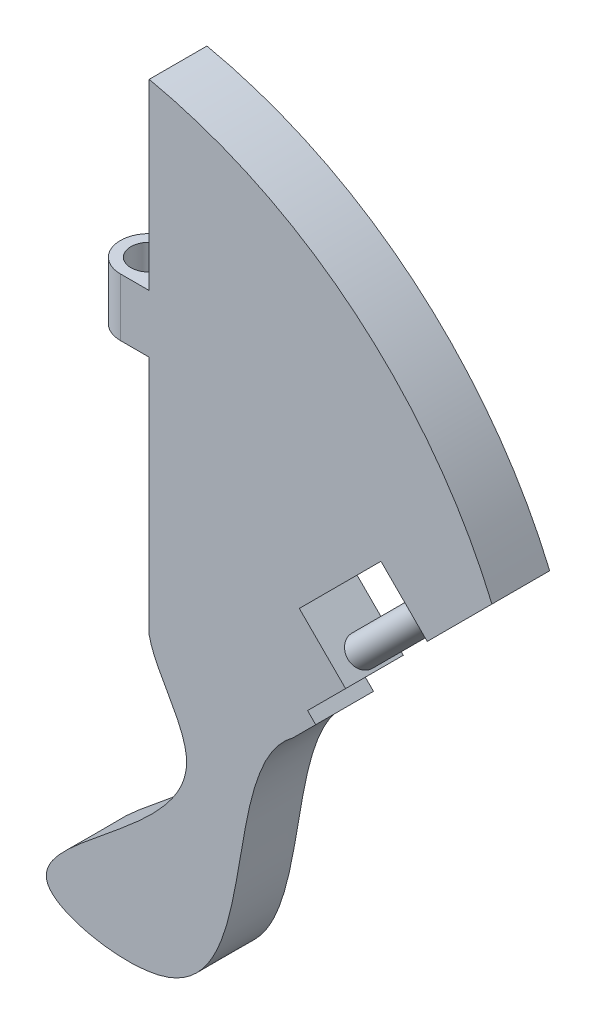
ISO-10303-21;
HEADER;
FILE_DESCRIPTION(('STEP AP214'),'2;1');
FILE_NAME('part.step','',(''),(''),'','','');
FILE_SCHEMA(('AUTOMOTIVE_DESIGN { 1 0 10303 214 1 1 1 1 }'));
ENDSEC;
DATA;
#1=APPLICATION_CONTEXT('core data for automotive mechanical design processes');
#2=APPLICATION_PROTOCOL_DEFINITION('international standard','automotive_design',2000,#1);
#3=PRODUCT_CONTEXT('',#1,'mechanical');
#4=PRODUCT('Part','Part','',(#3));
#5=PRODUCT_RELATED_PRODUCT_CATEGORY('part','',(#4));
#6=PRODUCT_DEFINITION_FORMATION('','',#4);
#7=PRODUCT_DEFINITION_CONTEXT('part definition',#1,'design');
#8=PRODUCT_DEFINITION('design','',#6,#7);
#9=PRODUCT_DEFINITION_SHAPE('','',#8);
#10=(LENGTH_UNIT() NAMED_UNIT(*) SI_UNIT(.MILLI.,.METRE.));
#11=(NAMED_UNIT(*) PLANE_ANGLE_UNIT() SI_UNIT($,.RADIAN.));
#12=(NAMED_UNIT(*) SI_UNIT($,.STERADIAN.) SOLID_ANGLE_UNIT());
#13=UNCERTAINTY_MEASURE_WITH_UNIT(LENGTH_MEASURE(1.E-05),#10,'distance_accuracy_value','');
#14=(GEOMETRIC_REPRESENTATION_CONTEXT(3) GLOBAL_UNCERTAINTY_ASSIGNED_CONTEXT((#13)) GLOBAL_UNIT_ASSIGNED_CONTEXT((#10,
#11,#12)) REPRESENTATION_CONTEXT('',''));
#15=CARTESIAN_POINT('',(0.,0.,0.));
#16=DIRECTION('',(0.,0.,1.));
#17=DIRECTION('',(1.,0.,0.));
#18=AXIS2_PLACEMENT_3D('',#15,#16,#17);
#19=CARTESIAN_POINT('',(-10.4366280712655,1.10136203837501,6.));
#20=DIRECTION('',(0.,0.,-1.));
#21=DIRECTION('',(-1.,0.,0.));
#22=AXIS2_PLACEMENT_3D('',#19,#20,#21);
#23=CYLINDRICAL_SURFACE('',#22,50.);
#24=DIRECTION('',(0.,0.,1.));
#25=VECTOR('',#24,1.);
#26=CARTESIAN_POINT('',(35.6094620937742,20.5887318073571,-4.));
#27=LINE('',#26,#25);
#28=CARTESIAN_POINT('',(35.6094620937742,20.5887318073571,0.));
#29=VERTEX_POINT('',#28);
#30=CARTESIAN_POINT('',(35.6094620937742,20.5887318073571,6.));
#31=VERTEX_POINT('',#30);
#32=EDGE_CURVE('E73',#29,#31,#27,.T.);
#33=ORIENTED_EDGE('',*,*,#32,.F.);
#34=CARTESIAN_POINT('',(-10.4366280712655,1.10136203837501,0.));
#35=DIRECTION('',(0.,0.,1.));
#36=DIRECTION('',(-1.,0.,0.));
#37=AXIS2_PLACEMENT_3D('',#34,#35,#36);
#38=CIRCLE('',#37,50.);
#39=CARTESIAN_POINT('',(0.,50.,0.));
#40=VERTEX_POINT('',#39);
#41=EDGE_CURVE('E261',#29,#40,#38,.T.);
#42=ORIENTED_EDGE('',*,*,#41,.T.);
#43=DIRECTION('',(0.,0.,-1.));
#44=VECTOR('',#43,1.);
#45=CARTESIAN_POINT('',(0.,50.,6.));
#46=LINE('',#45,#44);
#47=CARTESIAN_POINT('',(0.,50.,6.));
#48=VERTEX_POINT('',#47);
#49=EDGE_CURVE('E275',#48,#40,#46,.T.);
#50=ORIENTED_EDGE('',*,*,#49,.F.);
#51=CARTESIAN_POINT('',(-10.4366280712655,1.10136203837501,6.));
#52=DIRECTION('',(0.,0.,-1.));
#53=DIRECTION('',(-1.,0.,0.));
#54=AXIS2_PLACEMENT_3D('',#51,#52,#53);
#55=CIRCLE('',#54,50.);
#56=EDGE_CURVE('E49',#31,#48,#55,.F.);
#57=ORIENTED_EDGE('',*,*,#56,.F.);
#58=EDGE_LOOP('',(#33,#42,#50,#57));
#59=FACE_BOUND('',#58,.T.);
#60=ADVANCED_FACE('F44',(#59),#23,.T.);
#61=CARTESIAN_POINT('',(-6.85450681759513,-29.845700061581,6.));
#62=DIRECTION('',(0.,0.,-1.));
#63=DIRECTION('',(-1.,0.,0.));
#64=AXIS2_PLACEMENT_3D('',#61,#62,#63);
#65=PLANE('',#64);
#66=DIRECTION('',(-0.707106781186547,-0.707106781186548,0.));
#67=VECTOR('',#66,1.);
#68=CARTESIAN_POINT('',(16.4542124342722,1.43348214785504,6.));
#69=LINE('',#68,#67);
#70=CARTESIAN_POINT('',(28.888688886492,13.8679586000749,6.));
#71=VERTEX_POINT('',#70);
#72=EDGE_CURVE('E64',#31,#71,#69,.T.);
#73=ORIENTED_EDGE('',*,*,#72,.F.);
#74=ORIENTED_EDGE('',*,*,#56,.T.);
#75=DIRECTION('',(0.,-1.,0.));
#76=VECTOR('',#75,1.);
#77=CARTESIAN_POINT('',(0.,0.,6.));
#78=LINE('',#77,#76);
#79=CARTESIAN_POINT('',(0.,31.,6.));
#80=VERTEX_POINT('',#79);
#81=EDGE_CURVE('E246',#48,#80,#78,.T.);
#82=ORIENTED_EDGE('',*,*,#81,.T.);
#83=DIRECTION('',(1.,0.,0.));
#84=VECTOR('',#83,1.);
#85=CARTESIAN_POINT('',(0.,31.,6.));
#86=LINE('',#85,#84);
#87=CARTESIAN_POINT('',(-3.,31.,6.));
#88=VERTEX_POINT('',#87);
#89=EDGE_CURVE('E210',#88,#80,#86,.T.);
#90=ORIENTED_EDGE('',*,*,#89,.F.);
#91=DIRECTION('',(0.,-1.,0.));
#92=VECTOR('',#91,1.);
#93=CARTESIAN_POINT('',(-3.,31.,6.));
#94=LINE('',#93,#92);
#95=CARTESIAN_POINT('',(-3.,25.,6.));
#96=VERTEX_POINT('',#95);
#97=EDGE_CURVE('E211',#88,#96,#94,.T.);
#98=ORIENTED_EDGE('',*,*,#97,.T.);
#99=DIRECTION('',(1.,0.,0.));
#100=VECTOR('',#99,1.);
#101=CARTESIAN_POINT('',(0.,25.,6.));
#102=LINE('',#101,#100);
#103=CARTESIAN_POINT('',(0.,25.,6.));
#104=VERTEX_POINT('',#103);
#105=EDGE_CURVE('E203',#96,#104,#102,.T.);
#106=ORIENTED_EDGE('',*,*,#105,.T.);
#107=CARTESIAN_POINT('',(0.,0.,6.));
#108=VERTEX_POINT('',#107);
#109=EDGE_CURVE('E244',#104,#108,#78,.T.);
#110=ORIENTED_EDGE('',*,*,#109,.T.);
#111=CARTESIAN_POINT('',(0.,0.,6.));
#112=CARTESIAN_POINT('',(0.623539065567449,-3.01124012954802,6.));
#113=CARTESIAN_POINT('',(11.2925292328732,-13.6920333765925,6.));
#114=CARTESIAN_POINT('',(-21.6003583581743,-27.4888048526351,6.));
#115=CARTESIAN_POINT('',(13.990569908304,-34.4152930157094,6.));
#116=CARTESIAN_POINT('',(6.99046095569585,-7.61540878572468,6.));
#117=CARTESIAN_POINT('',(14.8879746189983,-1.82981194226648,6.));
#118=B_SPLINE_CURVE_WITH_KNOTS('',3,(#111,#112,#113,#114,#115,#116,#117),.UNSPECIFIED.,.F.,.F.,
(4,1,1,1,4),(0.,0.133846332112517,0.436860552407082,0.593183307109971,1.),.UNSPECIFIED.);
#119=CARTESIAN_POINT('',(14.8879746189983,-1.82981194226648,6.));
#120=VERTEX_POINT('',#119);
#121=EDGE_CURVE('E229',#108,#120,#118,.T.);
#122=ORIENTED_EDGE('',*,*,#121,.T.);
#123=DIRECTION('',(0.707106781186547,0.707106781186548,0.));
#124=VECTOR('',#123,1.);
#125=CARTESIAN_POINT('',(14.8879746189983,-1.82981194226648,6.));
#126=LINE('',#125,#124);
#127=CARTESIAN_POINT('',(17.302740571696,0.584954010431188,6.));
#128=VERTEX_POINT('',#127);
#129=EDGE_CURVE('E240',#120,#128,#126,.T.);
#130=ORIENTED_EDGE('',*,*,#129,.T.);
#131=DIRECTION('',(0.707106781186548,-0.707106781186547,0.));
#132=VECTOR('',#131,1.);
#133=CARTESIAN_POINT('',(17.302740571696,0.584954010431188,6.));
#134=LINE('',#133,#132);
#135=CARTESIAN_POINT('',(16.4542124342722,1.43348214785504,6.));
#136=VERTEX_POINT('',#135);
#137=EDGE_CURVE('E330',#136,#128,#134,.T.);
#138=ORIENTED_EDGE('',*,*,#137,.F.);
#139=CARTESIAN_POINT('',(20.4034075122534,5.38267722583631,6.));
#140=VERTEX_POINT('',#139);
#141=EDGE_CURVE('E340',#140,#136,#69,.T.);
#142=ORIENTED_EDGE('',*,*,#141,.F.);
#143=DIRECTION('',(-0.707106781186547,0.707106781186548,0.));
#144=VECTOR('',#143,1.);
#145=CARTESIAN_POINT('',(15.5950814001849,10.1910033379048,6.));
#146=LINE('',#145,#144);
#147=CARTESIAN_POINT('',(15.5950814001849,10.1910033379048,6.));
#148=VERTEX_POINT('',#147);
#149=EDGE_CURVE('E182',#140,#148,#146,.T.);
#150=ORIENTED_EDGE('',*,*,#149,.T.);
#151=DIRECTION('',(0.707106781186548,0.707106781186547,0.));
#152=VECTOR('',#151,1.);
#153=CARTESIAN_POINT('',(24.0803627744235,18.6762847121434,6.));
#154=LINE('',#153,#152);
#155=CARTESIAN_POINT('',(24.0803627744235,18.6762847121434,6.));
#156=VERTEX_POINT('',#155);
#157=EDGE_CURVE('E169',#148,#156,#154,.T.);
#158=ORIENTED_EDGE('',*,*,#157,.T.);
#159=DIRECTION('',(0.707106781186547,-0.707106781186548,0.));
#160=VECTOR('',#159,1.);
#161=CARTESIAN_POINT('',(29.7372170239158,13.019430462651,6.));
#162=LINE('',#161,#160);
#163=EDGE_CURVE('E171',#156,#71,#162,.T.);
#164=ORIENTED_EDGE('',*,*,#163,.T.);
#165=EDGE_LOOP('',(#73,#74,#82,#90,#98,#106,#110,#122,#130,#138,#142,#150,#158,#164));
#166=FACE_BOUND('',#165,.T.);
#167=ADVANCED_FACE('F298',(#166),#65,.F.);
#168=CARTESIAN_POINT('',(14.8879746189983,-1.82981194226648,6.));
#169=DIRECTION('',(-0.707106781186548,0.707106781186547,0.));
#170=DIRECTION('',(-0.707106781186547,-0.707106781186548,0.));
#171=AXIS2_PLACEMENT_3D('',#168,#169,#170);
#172=PLANE('',#171);
#173=DIRECTION('',(0.707106781186547,0.707106781186548,0.));
#174=VECTOR('',#173,1.);
#175=CARTESIAN_POINT('',(14.8879746189983,-1.82981194226648,0.));
#176=LINE('',#175,#174);
#177=CARTESIAN_POINT('',(14.8879746189983,-1.82981194226648,0.));
#178=VERTEX_POINT('',#177);
#179=CARTESIAN_POINT('',(17.302740571696,0.584954010431188,0.));
#180=VERTEX_POINT('',#179);
#181=EDGE_CURVE('E255',#178,#180,#176,.T.);
#182=ORIENTED_EDGE('',*,*,#181,.T.);
#183=DIRECTION('',(0.,0.,1.));
#184=VECTOR('',#183,1.);
#185=CARTESIAN_POINT('',(17.302740571696,0.584954010431188,-4.));
#186=LINE('',#185,#184);
#187=EDGE_CURVE('E332',#180,#128,#186,.T.);
#188=ORIENTED_EDGE('',*,*,#187,.T.);
#189=ORIENTED_EDGE('',*,*,#129,.F.);
#190=DIRECTION('',(0.,0.,-1.));
#191=VECTOR('',#190,1.);
#192=CARTESIAN_POINT('',(14.8879746189983,-1.82981194226648,6.));
#193=LINE('',#192,#191);
#194=EDGE_CURVE('E277',#120,#178,#193,.T.);
#195=ORIENTED_EDGE('',*,*,#194,.T.);
#196=EDGE_LOOP('',(#182,#188,#189,#195));
#197=FACE_BOUND('',#196,.T.);
#198=ADVANCED_FACE('F353',(#197),#172,.F.);
#199=CARTESIAN_POINT('',(0.,0.,6.));
#200=DIRECTION('',(1.,0.,0.));
#201=DIRECTION('',(0.,0.,-1.));
#202=AXIS2_PLACEMENT_3D('',#199,#200,#201);
#203=PLANE('',#202);
#204=DIRECTION('',(0.,0.,-1.));
#205=VECTOR('',#204,1.);
#206=CARTESIAN_POINT('',(0.,31.,0.));
#207=LINE('',#206,#205);
#208=CARTESIAN_POINT('',(0.,31.,0.));
#209=VERTEX_POINT('',#208);
#210=EDGE_CURVE('E198',#80,#209,#207,.T.);
#211=ORIENTED_EDGE('',*,*,#210,.F.);
#212=ORIENTED_EDGE('',*,*,#81,.F.);
#213=ORIENTED_EDGE('',*,*,#49,.T.);
#214=DIRECTION('',(0.,-1.,0.));
#215=VECTOR('',#214,1.);
#216=CARTESIAN_POINT('',(0.,0.,0.));
#217=LINE('',#216,#215);
#218=EDGE_CURVE('E236',#40,#209,#217,.T.);
#219=ORIENTED_EDGE('',*,*,#218,.T.);
#220=EDGE_LOOP('',(#211,#212,#213,#219));
#221=FACE_BOUND('',#220,.T.);
#222=ADVANCED_FACE('F323',(#221),#203,.F.);
#223=DIRECTION('',(0.,0.,-1.));
#224=VECTOR('',#223,1.);
#225=SURFACE_OF_LINEAR_EXTRUSION('',#118,#224);
#226=CARTESIAN_POINT('',(0.,0.,0.));
#227=CARTESIAN_POINT('',(0.623539065567449,-3.01124012954802,0.));
#228=CARTESIAN_POINT('',(11.2925292328732,-13.6920333765925,0.));
#229=CARTESIAN_POINT('',(-21.6003583581743,-27.4888048526351,0.));
#230=CARTESIAN_POINT('',(13.990569908304,-34.4152930157094,0.));
#231=CARTESIAN_POINT('',(6.99046095569585,-7.61540878572468,0.));
#232=CARTESIAN_POINT('',(14.8879746189983,-1.82981194226648,0.));
#233=B_SPLINE_CURVE_WITH_KNOTS('',3,(#226,#227,#228,#229,#230,#231,#232),.UNSPECIFIED.,.F.,.F.,
(4,1,1,1,4),(0.,0.133846332112517,0.436860552407082,0.593183307109971,1.),.UNSPECIFIED.);
#234=CARTESIAN_POINT('',(0.,0.,0.));
#235=VERTEX_POINT('',#234);
#236=EDGE_CURVE('E228',#235,#178,#233,.T.);
#237=ORIENTED_EDGE('',*,*,#236,.T.);
#238=ORIENTED_EDGE('',*,*,#194,.F.);
#239=ORIENTED_EDGE('',*,*,#121,.F.);
#240=DIRECTION('',(0.,0.,-1.));
#241=VECTOR('',#240,1.);
#242=CARTESIAN_POINT('',(0.,0.,6.));
#243=LINE('',#242,#241);
#244=EDGE_CURVE('E280',#108,#235,#243,.T.);
#245=ORIENTED_EDGE('',*,*,#244,.T.);
#246=EDGE_LOOP('',(#237,#238,#239,#245));
#247=FACE_BOUND('',#246,.T.);
#248=ADVANCED_FACE('F50',(#247),#225,.F.);
#249=ORIENTED_EDGE('',*,*,#109,.F.);
#250=DIRECTION('',(0.,0.,-1.));
#251=VECTOR('',#250,1.);
#252=CARTESIAN_POINT('',(0.,25.,0.));
#253=LINE('',#252,#251);
#254=CARTESIAN_POINT('',(0.,25.,0.));
#255=VERTEX_POINT('',#254);
#256=EDGE_CURVE('E195',#104,#255,#253,.T.);
#257=ORIENTED_EDGE('',*,*,#256,.T.);
#258=EDGE_CURVE('E268',#255,#235,#217,.T.);
#259=ORIENTED_EDGE('',*,*,#258,.T.);
#260=ORIENTED_EDGE('',*,*,#244,.F.);
#261=EDGE_LOOP('',(#249,#257,#259,#260));
#262=FACE_BOUND('',#261,.T.);
#263=ADVANCED_FACE('F317',(#262),#203,.F.);
#264=CARTESIAN_POINT('',(-6.85450681759513,-29.845700061581,0.));
#265=DIRECTION('',(0.,0.,-1.));
#266=DIRECTION('',(-1.,0.,0.));
#267=AXIS2_PLACEMENT_3D('',#264,#265,#266);
#268=PLANE('',#267);
#269=DIRECTION('',(-0.707106781186548,0.707106781186547,0.));
#270=VECTOR('',#269,1.);
#271=CARTESIAN_POINT('',(20.4394439130565,-2.55174933092933,0.));
#272=LINE('',#271,#270);
#273=CARTESIAN_POINT('',(16.4542124342722,1.43348214785504,0.));
#274=VERTEX_POINT('',#273);
#275=EDGE_CURVE('E11',#180,#274,#272,.T.);
#276=ORIENTED_EDGE('',*,*,#275,.F.);
#277=ORIENTED_EDGE('',*,*,#181,.F.);
#278=ORIENTED_EDGE('',*,*,#236,.F.);
#279=ORIENTED_EDGE('',*,*,#258,.F.);
#280=DIRECTION('',(-1.,0.,0.));
#281=VECTOR('',#280,1.);
#282=CARTESIAN_POINT('',(0.,25.,0.));
#283=LINE('',#282,#281);
#284=CARTESIAN_POINT('',(-3.,25.,0.));
#285=VERTEX_POINT('',#284);
#286=EDGE_CURVE('E212',#255,#285,#283,.T.);
#287=ORIENTED_EDGE('',*,*,#286,.T.);
#288=DIRECTION('',(0.,-1.,0.));
#289=VECTOR('',#288,1.);
#290=CARTESIAN_POINT('',(-3.,31.,0.));
#291=LINE('',#290,#289);
#292=CARTESIAN_POINT('',(-3.,31.,0.));
#293=VERTEX_POINT('',#292);
#294=EDGE_CURVE('E226',#293,#285,#291,.T.);
#295=ORIENTED_EDGE('',*,*,#294,.F.);
#296=DIRECTION('',(-1.,0.,0.));
#297=VECTOR('',#296,1.);
#298=CARTESIAN_POINT('',(0.,31.,0.));
#299=LINE('',#298,#297);
#300=EDGE_CURVE('E199',#209,#293,#299,.T.);
#301=ORIENTED_EDGE('',*,*,#300,.F.);
#302=ORIENTED_EDGE('',*,*,#218,.F.);
#303=ORIENTED_EDGE('',*,*,#41,.F.);
#304=DIRECTION('',(0.707106781186547,0.707106781186548,0.));
#305=VECTOR('',#304,1.);
#306=CARTESIAN_POINT('',(-10.8397382963795,-25.8604685827966,0.));
#307=LINE('',#306,#305);
#308=CARTESIAN_POINT('',(28.888688886492,13.8679586000749,0.));
#309=VERTEX_POINT('',#308);
#310=EDGE_CURVE('E161',#309,#29,#307,.T.);
#311=ORIENTED_EDGE('',*,*,#310,.F.);
#312=DIRECTION('',(0.707106781186547,-0.707106781186548,0.));
#313=VECTOR('',#312,1.);
#314=CARTESIAN_POINT('',(29.7372170239158,13.019430462651,0.));
#315=LINE('',#314,#313);
#316=CARTESIAN_POINT('',(24.0803627744235,18.6762847121434,0.));
#317=VERTEX_POINT('',#316);
#318=EDGE_CURVE('E180',#317,#309,#315,.T.);
#319=ORIENTED_EDGE('',*,*,#318,.F.);
#320=DIRECTION('',(0.707106781186548,0.707106781186547,0.));
#321=VECTOR('',#320,1.);
#322=CARTESIAN_POINT('',(24.0803627744235,18.6762847121434,0.));
#323=LINE('',#322,#321);
#324=CARTESIAN_POINT('',(15.5950814001849,10.1910033379048,0.));
#325=VERTEX_POINT('',#324);
#326=EDGE_CURVE('E159',#325,#317,#323,.T.);
#327=ORIENTED_EDGE('',*,*,#326,.F.);
#328=DIRECTION('',(-0.707106781186547,0.707106781186548,0.));
#329=VECTOR('',#328,1.);
#330=CARTESIAN_POINT('',(15.5950814001849,10.1910033379048,0.));
#331=LINE('',#330,#329);
#332=CARTESIAN_POINT('',(20.4034075122534,5.38267722583631,0.));
#333=VERTEX_POINT('',#332);
#334=EDGE_CURVE('E147',#333,#325,#331,.T.);
#335=ORIENTED_EDGE('',*,*,#334,.F.);
#336=EDGE_CURVE('E338',#274,#333,#307,.T.);
#337=ORIENTED_EDGE('',*,*,#336,.F.);
#338=EDGE_LOOP('',(#276,#277,#278,#279,#287,#295,#301,#302,#303,#311,#319,#327,#335,#337));
#339=FACE_BOUND('',#338,.T.);
#340=ADVANCED_FACE('F173',(#339),#268,.T.);
#341=CARTESIAN_POINT('',(-3.,31.,3.));
#342=DIRECTION('',(0.,-1.,0.));
#343=DIRECTION('',(0.,0.,-1.));
#344=AXIS2_PLACEMENT_3D('',#341,#342,#343);
#345=CYLINDRICAL_SURFACE('',#344,3.);
#346=CARTESIAN_POINT('',(-3.,25.,3.));
#347=DIRECTION('',(0.,1.,0.));
#348=DIRECTION('',(0.,0.,1.));
#349=AXIS2_PLACEMENT_3D('',#346,#347,#348);
#350=CIRCLE('',#349,3.);
#351=EDGE_CURVE('E220',#285,#96,#350,.T.);
#352=ORIENTED_EDGE('',*,*,#351,.T.);
#353=ORIENTED_EDGE('',*,*,#97,.F.);
#354=CARTESIAN_POINT('',(-3.,31.,3.));
#355=DIRECTION('',(0.,1.,0.));
#356=DIRECTION('',(0.,0.,1.));
#357=AXIS2_PLACEMENT_3D('',#354,#355,#356);
#358=CIRCLE('',#357,3.);
#359=EDGE_CURVE('E204',#293,#88,#358,.T.);
#360=ORIENTED_EDGE('',*,*,#359,.F.);
#361=ORIENTED_EDGE('',*,*,#294,.T.);
#362=EDGE_LOOP('',(#352,#353,#360,#361));
#363=FACE_BOUND('',#362,.T.);
#364=ADVANCED_FACE('F309',(#363),#345,.T.);
#365=CARTESIAN_POINT('',(-3.,31.,3.));
#366=DIRECTION('',(0.,1.,0.));
#367=DIRECTION('',(0.,0.,1.));
#368=AXIS2_PLACEMENT_3D('',#365,#366,#367);
#369=PLANE('',#368);
#370=CARTESIAN_POINT('',(-3.,31.,3.));
#371=DIRECTION('',(0.,1.,0.));
#372=DIRECTION('',(0.,0.,1.));
#373=AXIS2_PLACEMENT_3D('',#370,#371,#372);
#374=CIRCLE('',#373,1.9);
#375=CARTESIAN_POINT('',(-3.,31.,4.9));
#376=VERTEX_POINT('',#375);
#377=EDGE_CURVE('E186',#376,#376,#374,.T.);
#378=ORIENTED_EDGE('',*,*,#377,.F.);
#379=EDGE_LOOP('',(#378));
#380=FACE_BOUND('',#379,.T.);
#381=ORIENTED_EDGE('',*,*,#210,.T.);
#382=ORIENTED_EDGE('',*,*,#300,.T.);
#383=ORIENTED_EDGE('',*,*,#359,.T.);
#384=ORIENTED_EDGE('',*,*,#89,.T.);
#385=EDGE_LOOP('',(#381,#382,#383,#384));
#386=FACE_BOUND('',#385,.T.);
#387=ADVANCED_FACE('F304',(#380,#386),#369,.T.);
#388=CARTESIAN_POINT('',(-3.,25.,3.));
#389=DIRECTION('',(0.,1.,0.));
#390=DIRECTION('',(0.,0.,1.));
#391=AXIS2_PLACEMENT_3D('',#388,#389,#390);
#392=PLANE('',#391);
#393=CARTESIAN_POINT('',(-3.,25.,3.));
#394=DIRECTION('',(0.,1.,0.));
#395=DIRECTION('',(0.,0.,1.));
#396=AXIS2_PLACEMENT_3D('',#393,#394,#395);
#397=CIRCLE('',#396,1.9);
#398=CARTESIAN_POINT('',(-3.,25.,4.9));
#399=VERTEX_POINT('',#398);
#400=EDGE_CURVE('E187',#399,#399,#397,.T.);
#401=ORIENTED_EDGE('',*,*,#400,.T.);
#402=EDGE_LOOP('',(#401));
#403=FACE_BOUND('',#402,.T.);
#404=ORIENTED_EDGE('',*,*,#256,.F.);
#405=ORIENTED_EDGE('',*,*,#105,.F.);
#406=ORIENTED_EDGE('',*,*,#351,.F.);
#407=ORIENTED_EDGE('',*,*,#286,.F.);
#408=EDGE_LOOP('',(#404,#405,#406,#407));
#409=FACE_BOUND('',#408,.T.);
#410=ADVANCED_FACE('F312',(#403,#409),#392,.F.);
#411=CARTESIAN_POINT('',(-3.,25.,3.));
#412=DIRECTION('',(0.,1.,0.));
#413=DIRECTION('',(0.,0.,1.));
#414=AXIS2_PLACEMENT_3D('',#411,#412,#413);
#415=CYLINDRICAL_SURFACE('',#414,1.9);
#416=ORIENTED_EDGE('',*,*,#400,.F.);
#417=EDGE_LOOP('',(#416));
#418=FACE_BOUND('',#417,.T.);
#419=ORIENTED_EDGE('',*,*,#377,.T.);
#420=EDGE_LOOP('',(#419));
#421=FACE_BOUND('',#420,.T.);
#422=ADVANCED_FACE('F371',(#418,#421),#415,.F.);
#423=CARTESIAN_POINT('',(29.7372170239158,13.019430462651,6.));
#424=DIRECTION('',(0.707106781186548,0.707106781186547,0.));
#425=DIRECTION('',(-0.707106781186547,0.707106781186548,0.));
#426=AXIS2_PLACEMENT_3D('',#423,#424,#425);
#427=PLANE('',#426);
#428=CARTESIAN_POINT('',(27.6158966803562,15.1407508062107,3.));
#429=DIRECTION('',(0.707106781186548,0.707106781186547,0.));
#430=DIRECTION('',(-0.707106781186547,0.707106781186548,0.));
#431=AXIS2_PLACEMENT_3D('',#428,#429,#430);
#432=CIRCLE('',#431,1.5);
#433=CARTESIAN_POINT('',(26.5552365085764,16.2014109779905,3.));
#434=VERTEX_POINT('',#433);
#435=EDGE_CURVE('E271',#434,#434,#432,.F.);
#436=ORIENTED_EDGE('',*,*,#435,.F.);
#437=EDGE_LOOP('',(#436));
#438=FACE_BOUND('',#437,.T.);
#439=ORIENTED_EDGE('',*,*,#318,.T.);
#440=DIRECTION('',(0.,0.,1.));
#441=VECTOR('',#440,1.);
#442=CARTESIAN_POINT('',(28.888688886492,13.8679586000749,6.));
#443=LINE('',#442,#441);
#444=EDGE_CURVE('E360',#309,#71,#443,.T.);
#445=ORIENTED_EDGE('',*,*,#444,.T.);
#446=ORIENTED_EDGE('',*,*,#163,.F.);
#447=DIRECTION('',(0.,0.,-1.));
#448=VECTOR('',#447,1.);
#449=CARTESIAN_POINT('',(24.0803627744235,18.6762847121434,6.));
#450=LINE('',#449,#448);
#451=EDGE_CURVE('E168',#156,#317,#450,.T.);
#452=ORIENTED_EDGE('',*,*,#451,.T.);
#453=EDGE_LOOP('',(#439,#445,#446,#452));
#454=FACE_BOUND('',#453,.T.);
#455=ADVANCED_FACE('F369',(#438,#454),#427,.F.);
#456=CARTESIAN_POINT('',(24.0803627744235,18.6762847121434,6.));
#457=DIRECTION('',(-0.707106781186547,0.707106781186548,0.));
#458=DIRECTION('',(-0.707106781186548,-0.707106781186547,0.));
#459=AXIS2_PLACEMENT_3D('',#456,#457,#458);
#460=PLANE('',#459);
#461=ORIENTED_EDGE('',*,*,#326,.T.);
#462=ORIENTED_EDGE('',*,*,#451,.F.);
#463=ORIENTED_EDGE('',*,*,#157,.F.);
#464=DIRECTION('',(0.,0.,-1.));
#465=VECTOR('',#464,1.);
#466=CARTESIAN_POINT('',(15.5950814001849,10.1910033379048,6.));
#467=LINE('',#466,#465);
#468=EDGE_CURVE('E152',#148,#325,#467,.T.);
#469=ORIENTED_EDGE('',*,*,#468,.T.);
#470=EDGE_LOOP('',(#461,#462,#463,#469));
#471=FACE_BOUND('',#470,.T.);
#472=ADVANCED_FACE('F164',(#471),#460,.F.);
#473=CARTESIAN_POINT('',(15.5950814001849,10.1910033379048,6.));
#474=DIRECTION('',(-0.707106781186548,-0.707106781186547,0.));
#475=DIRECTION('',(0.707106781186547,-0.707106781186548,0.));
#476=AXIS2_PLACEMENT_3D('',#473,#474,#475);
#477=PLANE('',#476);
#478=CARTESIAN_POINT('',(19.1306153061176,6.65546943197209,3.));
#479=DIRECTION('',(-0.707106781186548,-0.707106781186547,0.));
#480=DIRECTION('',(0.707106781186547,-0.707106781186548,0.));
#481=AXIS2_PLACEMENT_3D('',#478,#479,#480);
#482=CIRCLE('',#481,1.5);
#483=CARTESIAN_POINT('',(20.1912754778975,5.59480926019227,3.));
#484=VERTEX_POINT('',#483);
#485=EDGE_CURVE('E281',#484,#484,#482,.F.);
#486=ORIENTED_EDGE('',*,*,#485,.F.);
#487=EDGE_LOOP('',(#486));
#488=FACE_BOUND('',#487,.T.);
#489=ORIENTED_EDGE('',*,*,#149,.F.);
#490=DIRECTION('',(0.,0.,-1.));
#491=VECTOR('',#490,1.);
#492=CARTESIAN_POINT('',(20.4034075122534,5.38267722583631,6.));
#493=LINE('',#492,#491);
#494=EDGE_CURVE('E60',#140,#333,#493,.T.);
#495=ORIENTED_EDGE('',*,*,#494,.T.);
#496=ORIENTED_EDGE('',*,*,#334,.T.);
#497=ORIENTED_EDGE('',*,*,#468,.F.);
#498=EDGE_LOOP('',(#489,#495,#496,#497));
#499=FACE_BOUND('',#498,.T.);
#500=ADVANCED_FACE('F153',(#488,#499),#477,.F.);
#501=CARTESIAN_POINT('',(36.9266931935173,24.4515473193717,3.));
#502=DIRECTION('',(-0.707106781186548,-0.707106781186547,0.));
#503=DIRECTION('',(0.707106781186547,-0.707106781186548,0.));
#504=AXIS2_PLACEMENT_3D('',#501,#502,#503);
#505=CYLINDRICAL_SURFACE('',#504,1.5);
#506=ORIENTED_EDGE('',*,*,#485,.T.);
#507=EDGE_LOOP('',(#506));
#508=FACE_BOUND('',#507,.T.);
#509=ORIENTED_EDGE('',*,*,#435,.T.);
#510=EDGE_LOOP('',(#509));
#511=FACE_BOUND('',#510,.T.);
#512=ADVANCED_FACE('F412',(#508,#511),#505,.T.);
#513=CARTESIAN_POINT('',(16.4542124342722,1.43348214785504,-4.));
#514=DIRECTION('',(-0.707106781186548,0.707106781186547,0.));
#515=DIRECTION('',(-0.707106781186547,-0.707106781186548,0.));
#516=AXIS2_PLACEMENT_3D('',#513,#514,#515);
#517=PLANE('',#516);
#518=ORIENTED_EDGE('',*,*,#336,.T.);
#519=ORIENTED_EDGE('',*,*,#494,.F.);
#520=ORIENTED_EDGE('',*,*,#141,.T.);
#521=DIRECTION('',(0.,0.,1.));
#522=VECTOR('',#521,1.);
#523=CARTESIAN_POINT('',(16.4542124342722,1.43348214785504,-4.));
#524=LINE('',#523,#522);
#525=EDGE_CURVE('E85',#274,#136,#524,.T.);
#526=ORIENTED_EDGE('',*,*,#525,.F.);
#527=EDGE_LOOP('',(#518,#519,#520,#526));
#528=FACE_BOUND('',#527,.T.);
#529=ADVANCED_FACE('F348',(#528),#517,.F.);
#530=CARTESIAN_POINT('',(17.302740571696,0.584954010431188,-4.));
#531=DIRECTION('',(-0.707106781186547,-0.707106781186548,0.));
#532=DIRECTION('',(0.707106781186548,-0.707106781186547,0.));
#533=AXIS2_PLACEMENT_3D('',#530,#531,#532);
#534=PLANE('',#533);
#535=ORIENTED_EDGE('',*,*,#275,.T.);
#536=ORIENTED_EDGE('',*,*,#525,.T.);
#537=ORIENTED_EDGE('',*,*,#137,.T.);
#538=ORIENTED_EDGE('',*,*,#187,.F.);
#539=EDGE_LOOP('',(#535,#536,#537,#538));
#540=FACE_BOUND('',#539,.T.);
#541=ADVANCED_FACE('F355',(#540),#534,.F.);
#542=ORIENTED_EDGE('',*,*,#310,.T.);
#543=ORIENTED_EDGE('',*,*,#32,.T.);
#544=ORIENTED_EDGE('',*,*,#72,.T.);
#545=ORIENTED_EDGE('',*,*,#444,.F.);
#546=EDGE_LOOP('',(#542,#543,#544,#545));
#547=FACE_BOUND('',#546,.T.);
#548=ADVANCED_FACE('F426',(#547),#517,.F.);
#549=CLOSED_SHELL('',(#60,#167,#198,#222,#248,#263,#340,#364,#387,#410,#422,#455,#472,#500,#512,
#529,#541,#548));
#550=MANIFOLD_SOLID_BREP('B2',#549);
#551=ADVANCED_BREP_SHAPE_REPRESENTATION('',(#18,#550),#14);
#552=SHAPE_DEFINITION_REPRESENTATION(#9,#551);
ENDSEC;
END-ISO-10303-21;
